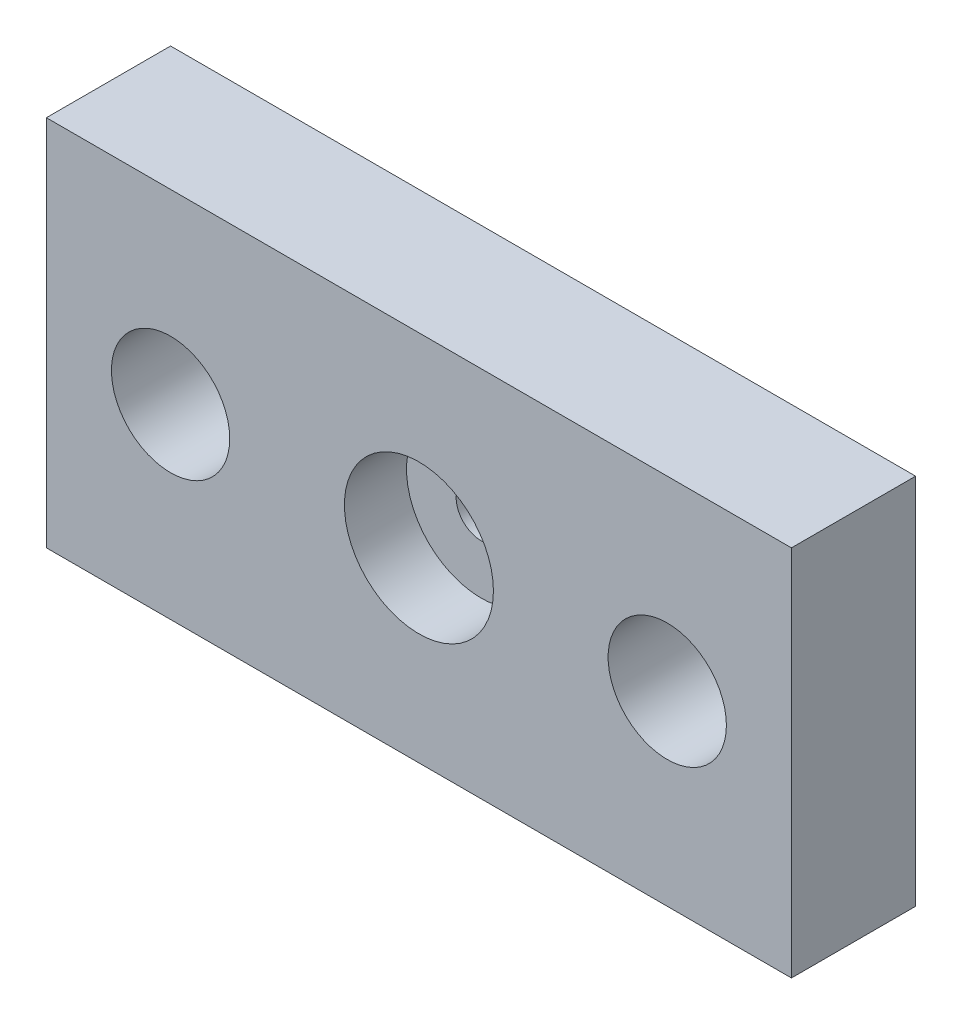
ISO-10303-21;
HEADER;
FILE_DESCRIPTION(('STEP AP214'),'2;1');
FILE_NAME('part.step','',(''),(''),'','','');
FILE_SCHEMA(('AUTOMOTIVE_DESIGN { 1 0 10303 214 1 1 1 1 }'));
ENDSEC;
DATA;
#1=APPLICATION_CONTEXT('core data for automotive mechanical design processes');
#2=APPLICATION_PROTOCOL_DEFINITION('international standard','automotive_design',2000,#1);
#3=PRODUCT_CONTEXT('',#1,'mechanical');
#4=PRODUCT('Part','Part','',(#3));
#5=PRODUCT_RELATED_PRODUCT_CATEGORY('part','',(#4));
#6=PRODUCT_DEFINITION_FORMATION('','',#4);
#7=PRODUCT_DEFINITION_CONTEXT('part definition',#1,'design');
#8=PRODUCT_DEFINITION('design','',#6,#7);
#9=PRODUCT_DEFINITION_SHAPE('','',#8);
#10=(LENGTH_UNIT() NAMED_UNIT(*) SI_UNIT(.MILLI.,.METRE.));
#11=(NAMED_UNIT(*) PLANE_ANGLE_UNIT() SI_UNIT($,.RADIAN.));
#12=(NAMED_UNIT(*) SI_UNIT($,.STERADIAN.) SOLID_ANGLE_UNIT());
#13=UNCERTAINTY_MEASURE_WITH_UNIT(LENGTH_MEASURE(1.E-05),#10,'distance_accuracy_value','');
#14=(GEOMETRIC_REPRESENTATION_CONTEXT(3) GLOBAL_UNCERTAINTY_ASSIGNED_CONTEXT((#13)) GLOBAL_UNIT_ASSIGNED_CONTEXT((#10,
#11,#12)) REPRESENTATION_CONTEXT('',''));
#15=CARTESIAN_POINT('',(0.,0.,0.));
#16=DIRECTION('',(0.,0.,1.));
#17=DIRECTION('',(1.,0.,0.));
#18=AXIS2_PLACEMENT_3D('',#15,#16,#17);
#19=CARTESIAN_POINT('',(0.,0.,5.));
#20=DIRECTION('',(0.,0.,-1.));
#21=DIRECTION('',(-1.,0.,0.));
#22=AXIS2_PLACEMENT_3D('',#19,#20,#21);
#23=CYLINDRICAL_SURFACE('',#22,1.);
#24=CARTESIAN_POINT('',(0.,0.,0.));
#25=DIRECTION('',(0.,0.,1.));
#26=DIRECTION('',(1.,0.,0.));
#27=AXIS2_PLACEMENT_3D('',#24,#25,#26);
#28=CIRCLE('',#27,1.);
#29=CARTESIAN_POINT('',(0.999999999999993,0.,0.));
#30=VERTEX_POINT('',#29);
#31=EDGE_CURVE('E108',#30,#30,#28,.T.);
#32=ORIENTED_EDGE('',*,*,#31,.F.);
#33=EDGE_LOOP('',(#32));
#34=FACE_BOUND('',#33,.T.);
#35=CARTESIAN_POINT('',(0.,0.,2.5));
#36=DIRECTION('',(0.,0.,1.));
#37=DIRECTION('',(1.,0.,0.));
#38=AXIS2_PLACEMENT_3D('',#35,#36,#37);
#39=CIRCLE('',#38,1.);
#40=CARTESIAN_POINT('',(0.999999999999993,0.,2.5));
#41=VERTEX_POINT('',#40);
#42=EDGE_CURVE('E42',#41,#41,#39,.T.);
#43=ORIENTED_EDGE('',*,*,#42,.T.);
#44=EDGE_LOOP('',(#43));
#45=FACE_BOUND('',#44,.T.);
#46=ADVANCED_FACE('F38',(#34,#45),#23,.F.);
#47=CARTESIAN_POINT('',(0.,0.,5.));
#48=DIRECTION('',(0.,0.,-1.));
#49=DIRECTION('',(-1.,0.,0.));
#50=AXIS2_PLACEMENT_3D('',#47,#48,#49);
#51=PLANE('',#50);
#52=CARTESIAN_POINT('',(0.,0.,5.));
#53=DIRECTION('',(0.,0.,1.));
#54=DIRECTION('',(1.,0.,0.));
#55=AXIS2_PLACEMENT_3D('',#52,#53,#54);
#56=CIRCLE('',#55,3.);
#57=CARTESIAN_POINT('',(3.,0.,5.));
#58=VERTEX_POINT('',#57);
#59=EDGE_CURVE('E134',#58,#58,#56,.T.);
#60=ORIENTED_EDGE('',*,*,#59,.F.);
#61=EDGE_LOOP('',(#60));
#62=FACE_BOUND('',#61,.T.);
#63=DIRECTION('',(0.,1.,0.));
#64=VECTOR('',#63,1.);
#65=CARTESIAN_POINT('',(15.,-7.5,5.));
#66=LINE('',#65,#64);
#67=CARTESIAN_POINT('',(15.,-7.5,5.));
#68=VERTEX_POINT('',#67);
#69=CARTESIAN_POINT('',(15.,7.5,5.));
#70=VERTEX_POINT('',#69);
#71=EDGE_CURVE('E92',#68,#70,#66,.T.);
#72=ORIENTED_EDGE('',*,*,#71,.T.);
#73=DIRECTION('',(-1.,0.,0.));
#74=VECTOR('',#73,1.);
#75=CARTESIAN_POINT('',(-15.,7.5,5.));
#76=LINE('',#75,#74);
#77=CARTESIAN_POINT('',(-15.,7.5,5.));
#78=VERTEX_POINT('',#77);
#79=EDGE_CURVE('E86',#70,#78,#76,.T.);
#80=ORIENTED_EDGE('',*,*,#79,.T.);
#81=DIRECTION('',(0.,-1.,0.));
#82=VECTOR('',#81,1.);
#83=CARTESIAN_POINT('',(-15.,-7.5,5.));
#84=LINE('',#83,#82);
#85=CARTESIAN_POINT('',(-15.,-7.5,5.));
#86=VERTEX_POINT('',#85);
#87=EDGE_CURVE('E90',#78,#86,#84,.T.);
#88=ORIENTED_EDGE('',*,*,#87,.T.);
#89=DIRECTION('',(1.,0.,0.));
#90=VECTOR('',#89,1.);
#91=CARTESIAN_POINT('',(-15.,-7.5,5.));
#92=LINE('',#91,#90);
#93=EDGE_CURVE('E56',#86,#68,#92,.T.);
#94=ORIENTED_EDGE('',*,*,#93,.T.);
#95=EDGE_LOOP('',(#72,#80,#88,#94));
#96=FACE_BOUND('',#95,.T.);
#97=CARTESIAN_POINT('',(10.,0.,5.));
#98=DIRECTION('',(0.,0.,1.));
#99=DIRECTION('',(1.,0.,0.));
#100=AXIS2_PLACEMENT_3D('',#97,#98,#99);
#101=CIRCLE('',#100,2.38125);
#102=CARTESIAN_POINT('',(12.38125,0.,5.));
#103=VERTEX_POINT('',#102);
#104=EDGE_CURVE('E122',#103,#103,#101,.T.);
#105=ORIENTED_EDGE('',*,*,#104,.F.);
#106=EDGE_LOOP('',(#105));
#107=FACE_BOUND('',#106,.T.);
#108=CARTESIAN_POINT('',(-10.,0.,5.));
#109=DIRECTION('',(0.,0.,1.));
#110=DIRECTION('',(1.,0.,0.));
#111=AXIS2_PLACEMENT_3D('',#108,#109,#110);
#112=CIRCLE('',#111,2.38125);
#113=CARTESIAN_POINT('',(-7.61875,0.,5.));
#114=VERTEX_POINT('',#113);
#115=EDGE_CURVE('E126',#114,#114,#112,.T.);
#116=ORIENTED_EDGE('',*,*,#115,.F.);
#117=EDGE_LOOP('',(#116));
#118=FACE_BOUND('',#117,.T.);
#119=ADVANCED_FACE('F87',(#62,#96,#107,#118),#51,.F.);
#120=CARTESIAN_POINT('',(0.,0.,0.));
#121=DIRECTION('',(0.,0.,-1.));
#122=DIRECTION('',(-1.,0.,0.));
#123=AXIS2_PLACEMENT_3D('',#120,#121,#122);
#124=PLANE('',#123);
#125=CARTESIAN_POINT('',(10.,0.,0.));
#126=DIRECTION('',(0.,0.,1.));
#127=DIRECTION('',(1.,0.,0.));
#128=AXIS2_PLACEMENT_3D('',#125,#126,#127);
#129=CIRCLE('',#128,2.38125);
#130=CARTESIAN_POINT('',(12.38125,0.,0.));
#131=VERTEX_POINT('',#130);
#132=EDGE_CURVE('E123',#131,#131,#129,.T.);
#133=ORIENTED_EDGE('',*,*,#132,.T.);
#134=EDGE_LOOP('',(#133));
#135=FACE_BOUND('',#134,.T.);
#136=DIRECTION('',(0.,1.,0.));
#137=VECTOR('',#136,1.);
#138=CARTESIAN_POINT('',(15.,-7.5,0.));
#139=LINE('',#138,#137);
#140=CARTESIAN_POINT('',(15.,-7.5,0.));
#141=VERTEX_POINT('',#140);
#142=CARTESIAN_POINT('',(15.,7.5,0.));
#143=VERTEX_POINT('',#142);
#144=EDGE_CURVE('E105',#141,#143,#139,.T.);
#145=ORIENTED_EDGE('',*,*,#144,.F.);
#146=DIRECTION('',(1.,0.,0.));
#147=VECTOR('',#146,1.);
#148=CARTESIAN_POINT('',(-15.,-7.5,0.));
#149=LINE('',#148,#147);
#150=CARTESIAN_POINT('',(-15.,-7.5,0.));
#151=VERTEX_POINT('',#150);
#152=EDGE_CURVE('E79',#151,#141,#149,.T.);
#153=ORIENTED_EDGE('',*,*,#152,.F.);
#154=DIRECTION('',(0.,-1.,0.));
#155=VECTOR('',#154,1.);
#156=CARTESIAN_POINT('',(-15.,-7.5,0.));
#157=LINE('',#156,#155);
#158=CARTESIAN_POINT('',(-15.,7.5,0.));
#159=VERTEX_POINT('',#158);
#160=EDGE_CURVE('E73',#159,#151,#157,.T.);
#161=ORIENTED_EDGE('',*,*,#160,.F.);
#162=DIRECTION('',(-1.,0.,0.));
#163=VECTOR('',#162,1.);
#164=CARTESIAN_POINT('',(-15.,7.5,0.));
#165=LINE('',#164,#163);
#166=EDGE_CURVE('E96',#143,#159,#165,.T.);
#167=ORIENTED_EDGE('',*,*,#166,.F.);
#168=EDGE_LOOP('',(#145,#153,#161,#167));
#169=FACE_BOUND('',#168,.T.);
#170=ORIENTED_EDGE('',*,*,#31,.T.);
#171=EDGE_LOOP('',(#170));
#172=FACE_BOUND('',#171,.T.);
#173=CARTESIAN_POINT('',(-10.,0.,0.));
#174=DIRECTION('',(0.,0.,1.));
#175=DIRECTION('',(1.,0.,0.));
#176=AXIS2_PLACEMENT_3D('',#173,#174,#175);
#177=CIRCLE('',#176,2.38125);
#178=CARTESIAN_POINT('',(-7.61875,0.,0.));
#179=VERTEX_POINT('',#178);
#180=EDGE_CURVE('E129',#179,#179,#177,.T.);
#181=ORIENTED_EDGE('',*,*,#180,.T.);
#182=EDGE_LOOP('',(#181));
#183=FACE_BOUND('',#182,.T.);
#184=ADVANCED_FACE('F116',(#135,#169,#172,#183),#124,.T.);
#185=CARTESIAN_POINT('',(15.,-7.5,5.));
#186=DIRECTION('',(-1.,0.,0.));
#187=DIRECTION('',(0.,0.,1.));
#188=AXIS2_PLACEMENT_3D('',#185,#186,#187);
#189=PLANE('',#188);
#190=ORIENTED_EDGE('',*,*,#144,.T.);
#191=DIRECTION('',(0.,0.,-1.));
#192=VECTOR('',#191,1.);
#193=CARTESIAN_POINT('',(15.,7.5,5.));
#194=LINE('',#193,#192);
#195=EDGE_CURVE('E11',#70,#143,#194,.T.);
#196=ORIENTED_EDGE('',*,*,#195,.F.);
#197=ORIENTED_EDGE('',*,*,#71,.F.);
#198=DIRECTION('',(0.,0.,-1.));
#199=VECTOR('',#198,1.);
#200=CARTESIAN_POINT('',(15.,-7.5,5.));
#201=LINE('',#200,#199);
#202=EDGE_CURVE('E101',#68,#141,#201,.T.);
#203=ORIENTED_EDGE('',*,*,#202,.T.);
#204=EDGE_LOOP('',(#190,#196,#197,#203));
#205=FACE_BOUND('',#204,.T.);
#206=ADVANCED_FACE('F40',(#205),#189,.F.);
#207=CARTESIAN_POINT('',(-15.,7.5,5.));
#208=DIRECTION('',(0.,-1.,0.));
#209=DIRECTION('',(0.,0.,-1.));
#210=AXIS2_PLACEMENT_3D('',#207,#208,#209);
#211=PLANE('',#210);
#212=ORIENTED_EDGE('',*,*,#166,.T.);
#213=DIRECTION('',(0.,0.,-1.));
#214=VECTOR('',#213,1.);
#215=CARTESIAN_POINT('',(-15.,7.5,5.));
#216=LINE('',#215,#214);
#217=EDGE_CURVE('E48',#78,#159,#216,.T.);
#218=ORIENTED_EDGE('',*,*,#217,.F.);
#219=ORIENTED_EDGE('',*,*,#79,.F.);
#220=ORIENTED_EDGE('',*,*,#195,.T.);
#221=EDGE_LOOP('',(#212,#218,#219,#220));
#222=FACE_BOUND('',#221,.T.);
#223=ADVANCED_FACE('F95',(#222),#211,.F.);
#224=CARTESIAN_POINT('',(-15.,-7.5,5.));
#225=DIRECTION('',(1.,0.,0.));
#226=DIRECTION('',(0.,0.,-1.));
#227=AXIS2_PLACEMENT_3D('',#224,#225,#226);
#228=PLANE('',#227);
#229=ORIENTED_EDGE('',*,*,#160,.T.);
#230=DIRECTION('',(0.,0.,-1.));
#231=VECTOR('',#230,1.);
#232=CARTESIAN_POINT('',(-15.,-7.5,5.));
#233=LINE('',#232,#231);
#234=EDGE_CURVE('E97',#86,#151,#233,.T.);
#235=ORIENTED_EDGE('',*,*,#234,.F.);
#236=ORIENTED_EDGE('',*,*,#87,.F.);
#237=ORIENTED_EDGE('',*,*,#217,.T.);
#238=EDGE_LOOP('',(#229,#235,#236,#237));
#239=FACE_BOUND('',#238,.T.);
#240=ADVANCED_FACE('F99',(#239),#228,.F.);
#241=CARTESIAN_POINT('',(-15.,-7.5,5.));
#242=DIRECTION('',(0.,1.,0.));
#243=DIRECTION('',(0.,0.,1.));
#244=AXIS2_PLACEMENT_3D('',#241,#242,#243);
#245=PLANE('',#244);
#246=ORIENTED_EDGE('',*,*,#152,.T.);
#247=ORIENTED_EDGE('',*,*,#202,.F.);
#248=ORIENTED_EDGE('',*,*,#93,.F.);
#249=ORIENTED_EDGE('',*,*,#234,.T.);
#250=EDGE_LOOP('',(#246,#247,#248,#249));
#251=FACE_BOUND('',#250,.T.);
#252=ADVANCED_FACE('F113',(#251),#245,.F.);
#253=CARTESIAN_POINT('',(10.,0.,5.));
#254=DIRECTION('',(0.,0.,-1.));
#255=DIRECTION('',(-1.,0.,0.));
#256=AXIS2_PLACEMENT_3D('',#253,#254,#255);
#257=CYLINDRICAL_SURFACE('',#256,2.38125);
#258=ORIENTED_EDGE('',*,*,#104,.T.);
#259=EDGE_LOOP('',(#258));
#260=FACE_BOUND('',#259,.T.);
#261=ORIENTED_EDGE('',*,*,#132,.F.);
#262=EDGE_LOOP('',(#261));
#263=FACE_BOUND('',#262,.T.);
#264=ADVANCED_FACE('F165',(#260,#263),#257,.F.);
#265=CARTESIAN_POINT('',(-10.,0.,5.));
#266=DIRECTION('',(0.,0.,-1.));
#267=DIRECTION('',(-1.,0.,0.));
#268=AXIS2_PLACEMENT_3D('',#265,#266,#267);
#269=CYLINDRICAL_SURFACE('',#268,2.38125);
#270=ORIENTED_EDGE('',*,*,#115,.T.);
#271=EDGE_LOOP('',(#270));
#272=FACE_BOUND('',#271,.T.);
#273=ORIENTED_EDGE('',*,*,#180,.F.);
#274=EDGE_LOOP('',(#273));
#275=FACE_BOUND('',#274,.T.);
#276=ADVANCED_FACE('F152',(#272,#275),#269,.F.);
#277=CARTESIAN_POINT('',(0.,0.,2.5));
#278=DIRECTION('',(0.,0.,1.));
#279=DIRECTION('',(1.,0.,0.));
#280=AXIS2_PLACEMENT_3D('',#277,#278,#279);
#281=CYLINDRICAL_SURFACE('',#280,3.);
#282=CARTESIAN_POINT('',(0.,0.,2.5));
#283=DIRECTION('',(0.,0.,1.));
#284=DIRECTION('',(1.,0.,0.));
#285=AXIS2_PLACEMENT_3D('',#282,#283,#284);
#286=CIRCLE('',#285,3.);
#287=CARTESIAN_POINT('',(3.,0.,2.5));
#288=VERTEX_POINT('',#287);
#289=EDGE_CURVE('E137',#288,#288,#286,.T.);
#290=ORIENTED_EDGE('',*,*,#289,.F.);
#291=EDGE_LOOP('',(#290));
#292=FACE_BOUND('',#291,.T.);
#293=ORIENTED_EDGE('',*,*,#59,.T.);
#294=EDGE_LOOP('',(#293));
#295=FACE_BOUND('',#294,.T.);
#296=ADVANCED_FACE('F147',(#292,#295),#281,.F.);
#297=CARTESIAN_POINT('',(0.,0.,2.5));
#298=DIRECTION('',(0.,0.,1.));
#299=DIRECTION('',(1.,0.,0.));
#300=AXIS2_PLACEMENT_3D('',#297,#298,#299);
#301=PLANE('',#300);
#302=ORIENTED_EDGE('',*,*,#42,.F.);
#303=EDGE_LOOP('',(#302));
#304=FACE_BOUND('',#303,.T.);
#305=ORIENTED_EDGE('',*,*,#289,.T.);
#306=EDGE_LOOP('',(#305));
#307=FACE_BOUND('',#306,.T.);
#308=ADVANCED_FACE('F145',(#304,#307),#301,.T.);
#309=CLOSED_SHELL('',(#46,#119,#184,#206,#223,#240,#252,#264,#276,#296,#308));
#310=MANIFOLD_SOLID_BREP('B2',#309);
#311=ADVANCED_BREP_SHAPE_REPRESENTATION('',(#18,#310),#14);
#312=SHAPE_DEFINITION_REPRESENTATION(#9,#311);
ENDSEC;
END-ISO-10303-21;
